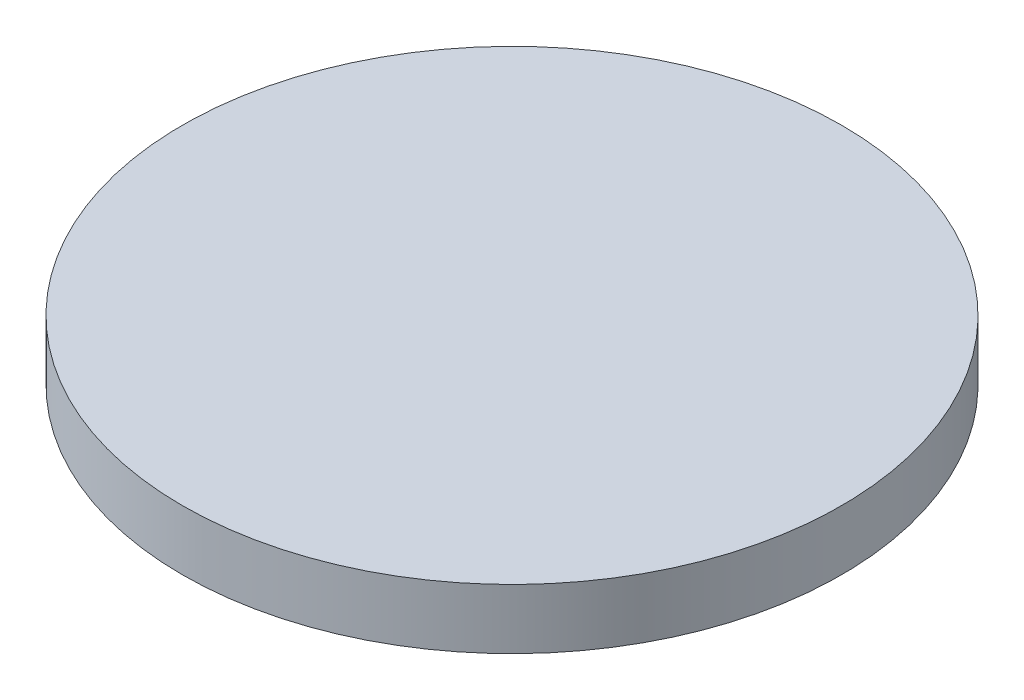
ISO-10303-21;
HEADER;
FILE_DESCRIPTION(('STEP AP214'),'2;1');
FILE_NAME('part.step','',(''),(''),'','','');
FILE_SCHEMA(('AUTOMOTIVE_DESIGN { 1 0 10303 214 1 1 1 1 }'));
ENDSEC;
DATA;
#1=APPLICATION_CONTEXT('core data for automotive mechanical design processes');
#2=APPLICATION_PROTOCOL_DEFINITION('international standard','automotive_design',2000,#1);
#3=PRODUCT_CONTEXT('',#1,'mechanical');
#4=PRODUCT('Part','Part','',(#3));
#5=PRODUCT_RELATED_PRODUCT_CATEGORY('part','',(#4));
#6=PRODUCT_DEFINITION_FORMATION('','',#4);
#7=PRODUCT_DEFINITION_CONTEXT('part definition',#1,'design');
#8=PRODUCT_DEFINITION('design','',#6,#7);
#9=PRODUCT_DEFINITION_SHAPE('','',#8);
#10=(LENGTH_UNIT() NAMED_UNIT(*) SI_UNIT(.MILLI.,.METRE.));
#11=(NAMED_UNIT(*) PLANE_ANGLE_UNIT() SI_UNIT($,.RADIAN.));
#12=(NAMED_UNIT(*) SI_UNIT($,.STERADIAN.) SOLID_ANGLE_UNIT());
#13=UNCERTAINTY_MEASURE_WITH_UNIT(LENGTH_MEASURE(1.E-05),#10,'distance_accuracy_value','');
#14=(GEOMETRIC_REPRESENTATION_CONTEXT(3) GLOBAL_UNCERTAINTY_ASSIGNED_CONTEXT((#13)) GLOBAL_UNIT_ASSIGNED_CONTEXT((#10,
#11,#12)) REPRESENTATION_CONTEXT('',''));
#15=CARTESIAN_POINT('',(0.,0.,0.));
#16=DIRECTION('',(0.,0.,1.));
#17=DIRECTION('',(1.,0.,0.));
#18=AXIS2_PLACEMENT_3D('',#15,#16,#17);
#19=CARTESIAN_POINT('',(0.,-0.5,0.));
#20=DIRECTION('',(0.,1.,0.));
#21=DIRECTION('',(0.,0.,1.));
#22=AXIS2_PLACEMENT_3D('',#19,#20,#21);
#23=CYLINDRICAL_SURFACE('',#22,2.75);
#24=CARTESIAN_POINT('',(0.,-0.5,0.));
#25=DIRECTION('',(0.,1.,0.));
#26=DIRECTION('',(0.,0.,1.));
#27=AXIS2_PLACEMENT_3D('',#24,#25,#26);
#28=CIRCLE('',#27,2.75);
#29=CARTESIAN_POINT('',(0.,-0.5,2.75));
#30=VERTEX_POINT('',#29);
#31=EDGE_CURVE('E10',#30,#30,#28,.T.);
#32=ORIENTED_EDGE('',*,*,#31,.T.);
#33=EDGE_LOOP('',(#32));
#34=FACE_BOUND('',#33,.T.);
#35=CARTESIAN_POINT('',(0.,0.,0.));
#36=DIRECTION('',(0.,1.,0.));
#37=DIRECTION('',(0.,0.,1.));
#38=AXIS2_PLACEMENT_3D('',#35,#36,#37);
#39=CIRCLE('',#38,2.75);
#40=CARTESIAN_POINT('',(0.,0.,2.75));
#41=VERTEX_POINT('',#40);
#42=EDGE_CURVE('E34',#41,#41,#39,.T.);
#43=ORIENTED_EDGE('',*,*,#42,.F.);
#44=EDGE_LOOP('',(#43));
#45=FACE_BOUND('',#44,.T.);
#46=ADVANCED_FACE('F31',(#34,#45),#23,.T.);
#47=CARTESIAN_POINT('',(0.,-0.5,0.));
#48=DIRECTION('',(0.,1.,0.));
#49=DIRECTION('',(0.,0.,1.));
#50=AXIS2_PLACEMENT_3D('',#47,#48,#49);
#51=PLANE('',#50);
#52=ORIENTED_EDGE('',*,*,#31,.F.);
#53=EDGE_LOOP('',(#52));
#54=FACE_BOUND('',#53,.T.);
#55=ADVANCED_FACE('F46',(#54),#51,.F.);
#56=CARTESIAN_POINT('',(0.,0.,0.));
#57=DIRECTION('',(0.,1.,0.));
#58=DIRECTION('',(0.,0.,1.));
#59=AXIS2_PLACEMENT_3D('',#56,#57,#58);
#60=PLANE('',#59);
#61=ORIENTED_EDGE('',*,*,#42,.T.);
#62=EDGE_LOOP('',(#61));
#63=FACE_BOUND('',#62,.T.);
#64=ADVANCED_FACE('F43',(#63),#60,.T.);
#65=CLOSED_SHELL('',(#46,#55,#64));
#66=MANIFOLD_SOLID_BREP('B2',#65);
#67=ADVANCED_BREP_SHAPE_REPRESENTATION('',(#18,#66),#14);
#68=SHAPE_DEFINITION_REPRESENTATION(#9,#67);
ENDSEC;
END-ISO-10303-21;
